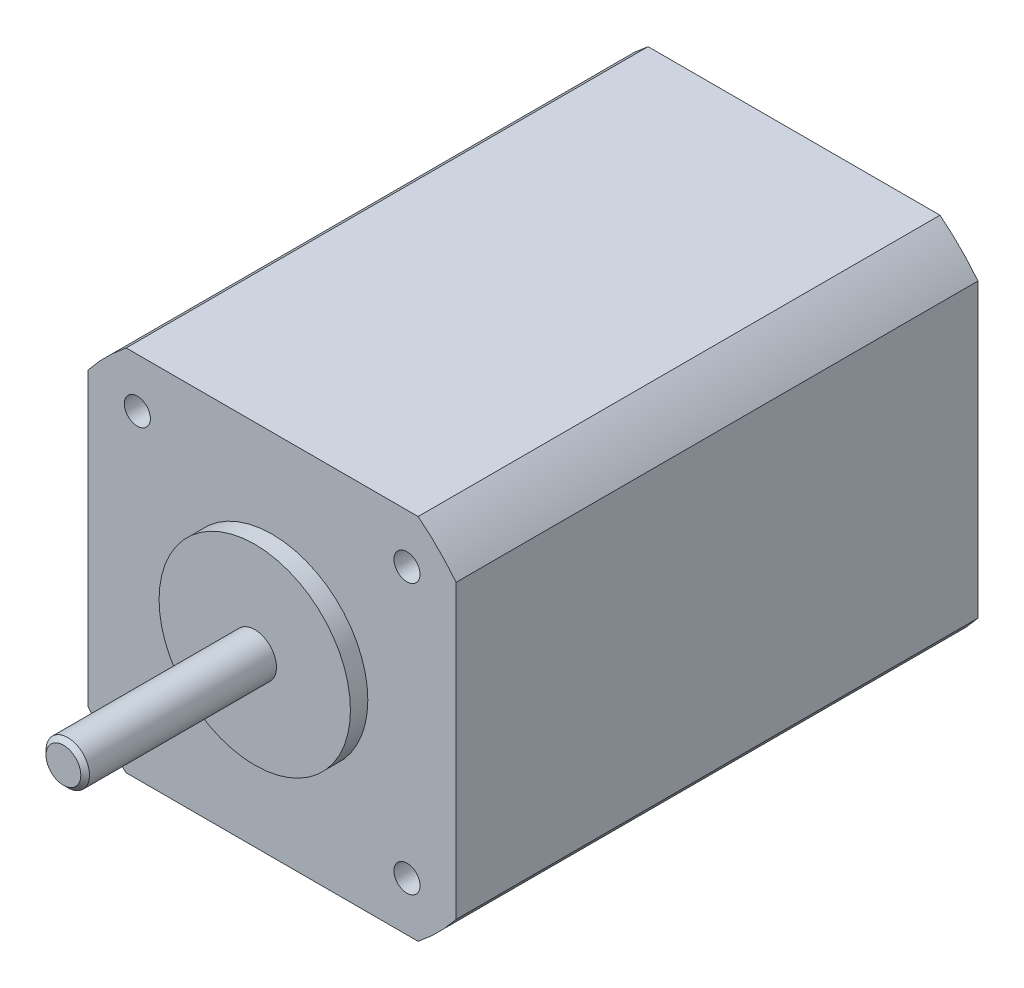
ISO-10303-21;
HEADER;
FILE_DESCRIPTION(('STEP AP214'),'2;1');
FILE_NAME('part.step','',(''),(''),'','','');
FILE_SCHEMA(('AUTOMOTIVE_DESIGN { 1 0 10303 214 1 1 1 1 }'));
ENDSEC;
DATA;
#1=APPLICATION_CONTEXT('core data for automotive mechanical design processes');
#2=APPLICATION_PROTOCOL_DEFINITION('international standard','automotive_design',2000,#1);
#3=PRODUCT_CONTEXT('',#1,'mechanical');
#4=PRODUCT('Part','Part','',(#3));
#5=PRODUCT_RELATED_PRODUCT_CATEGORY('part','',(#4));
#6=PRODUCT_DEFINITION_FORMATION('','',#4);
#7=PRODUCT_DEFINITION_CONTEXT('part definition',#1,'design');
#8=PRODUCT_DEFINITION('design','',#6,#7);
#9=PRODUCT_DEFINITION_SHAPE('','',#8);
#10=(LENGTH_UNIT() NAMED_UNIT(*) SI_UNIT(.MILLI.,.METRE.));
#11=(NAMED_UNIT(*) PLANE_ANGLE_UNIT() SI_UNIT($,.RADIAN.));
#12=(NAMED_UNIT(*) SI_UNIT($,.STERADIAN.) SOLID_ANGLE_UNIT());
#13=UNCERTAINTY_MEASURE_WITH_UNIT(LENGTH_MEASURE(1.E-05),#10,'distance_accuracy_value','');
#14=(GEOMETRIC_REPRESENTATION_CONTEXT(3) GLOBAL_UNCERTAINTY_ASSIGNED_CONTEXT((#13)) GLOBAL_UNIT_ASSIGNED_CONTEXT((#10,
#11,#12)) REPRESENTATION_CONTEXT('',''));
#15=CARTESIAN_POINT('',(0.,0.,0.));
#16=DIRECTION('',(0.,0.,1.));
#17=DIRECTION('',(1.,0.,0.));
#18=AXIS2_PLACEMENT_3D('',#15,#16,#17);
#19=CARTESIAN_POINT('',(21.15,-21.15,60.));
#20=DIRECTION('',(-1.,0.,0.));
#21=DIRECTION('',(0.,0.,1.));
#22=AXIS2_PLACEMENT_3D('',#19,#20,#21);
#23=PLANE('',#22);
#24=DIRECTION('',(0.,0.,1.));
#25=VECTOR('',#24,1.);
#26=CARTESIAN_POINT('',(21.15,-16.7832505790744,0.));
#27=LINE('',#26,#25);
#28=CARTESIAN_POINT('',(21.15,-16.7832505790744,0.));
#29=VERTEX_POINT('',#28);
#30=CARTESIAN_POINT('',(21.15,-16.7832505790744,60.));
#31=VERTEX_POINT('',#30);
#32=EDGE_CURVE('E170',#29,#31,#27,.T.);
#33=ORIENTED_EDGE('',*,*,#32,.F.);
#34=DIRECTION('',(0.,1.,0.));
#35=VECTOR('',#34,1.);
#36=CARTESIAN_POINT('',(21.15,-21.15,0.));
#37=LINE('',#36,#35);
#38=CARTESIAN_POINT('',(21.15,16.7832505790744,0.));
#39=VERTEX_POINT('',#38);
#40=EDGE_CURVE('E130',#29,#39,#37,.T.);
#41=ORIENTED_EDGE('',*,*,#40,.T.);
#42=DIRECTION('',(0.,0.,1.));
#43=VECTOR('',#42,1.);
#44=CARTESIAN_POINT('',(21.15,16.7832505790744,0.));
#45=LINE('',#44,#43);
#46=CARTESIAN_POINT('',(21.15,16.7832505790744,60.));
#47=VERTEX_POINT('',#46);
#48=EDGE_CURVE('E110',#47,#39,#45,.F.);
#49=ORIENTED_EDGE('',*,*,#48,.F.);
#50=DIRECTION('',(0.,1.,0.));
#51=VECTOR('',#50,1.);
#52=CARTESIAN_POINT('',(21.15,-21.15,60.));
#53=LINE('',#52,#51);
#54=EDGE_CURVE('E141',#31,#47,#53,.T.);
#55=ORIENTED_EDGE('',*,*,#54,.F.);
#56=EDGE_LOOP('',(#33,#41,#49,#55));
#57=FACE_BOUND('',#56,.T.);
#58=ADVANCED_FACE('F39',(#57),#23,.F.);
#59=CARTESIAN_POINT('',(-21.15,21.15,60.));
#60=DIRECTION('',(0.,-1.,0.));
#61=DIRECTION('',(0.,0.,-1.));
#62=AXIS2_PLACEMENT_3D('',#59,#60,#61);
#63=PLANE('',#62);
#64=DIRECTION('',(0.,0.,1.));
#65=VECTOR('',#64,1.);
#66=CARTESIAN_POINT('',(16.7832505790744,21.15,0.));
#67=LINE('',#66,#65);
#68=CARTESIAN_POINT('',(16.7832505790744,21.15,0.));
#69=VERTEX_POINT('',#68);
#70=CARTESIAN_POINT('',(16.7832505790744,21.15,60.));
#71=VERTEX_POINT('',#70);
#72=EDGE_CURVE('E107',#69,#71,#67,.T.);
#73=ORIENTED_EDGE('',*,*,#72,.F.);
#74=DIRECTION('',(-1.,0.,0.));
#75=VECTOR('',#74,1.);
#76=CARTESIAN_POINT('',(-21.15,21.15,0.));
#77=LINE('',#76,#75);
#78=CARTESIAN_POINT('',(-16.7832505790744,21.15,0.));
#79=VERTEX_POINT('',#78);
#80=EDGE_CURVE('E122',#69,#79,#77,.T.);
#81=ORIENTED_EDGE('',*,*,#80,.T.);
#82=DIRECTION('',(0.,0.,1.));
#83=VECTOR('',#82,1.);
#84=CARTESIAN_POINT('',(-16.7832505790744,21.15,0.));
#85=LINE('',#84,#83);
#86=CARTESIAN_POINT('',(-16.7832505790744,21.15,60.));
#87=VERTEX_POINT('',#86);
#88=EDGE_CURVE('E55',#87,#79,#85,.F.);
#89=ORIENTED_EDGE('',*,*,#88,.F.);
#90=DIRECTION('',(-1.,0.,0.));
#91=VECTOR('',#90,1.);
#92=CARTESIAN_POINT('',(-21.15,21.15,60.));
#93=LINE('',#92,#91);
#94=EDGE_CURVE('E124',#71,#87,#93,.T.);
#95=ORIENTED_EDGE('',*,*,#94,.F.);
#96=EDGE_LOOP('',(#73,#81,#89,#95));
#97=FACE_BOUND('',#96,.T.);
#98=ADVANCED_FACE('F121',(#97),#63,.F.);
#99=CARTESIAN_POINT('',(-21.15,-21.15,60.));
#100=DIRECTION('',(1.,0.,0.));
#101=DIRECTION('',(0.,0.,-1.));
#102=AXIS2_PLACEMENT_3D('',#99,#100,#101);
#103=PLANE('',#102);
#104=DIRECTION('',(0.,0.,1.));
#105=VECTOR('',#104,1.);
#106=CARTESIAN_POINT('',(-21.15,16.7832505790744,0.));
#107=LINE('',#106,#105);
#108=CARTESIAN_POINT('',(-21.15,16.7832505790744,0.));
#109=VERTEX_POINT('',#108);
#110=CARTESIAN_POINT('',(-21.15,16.7832505790744,60.));
#111=VERTEX_POINT('',#110);
#112=EDGE_CURVE('E166',#109,#111,#107,.T.);
#113=ORIENTED_EDGE('',*,*,#112,.F.);
#114=DIRECTION('',(0.,-1.,0.));
#115=VECTOR('',#114,1.);
#116=CARTESIAN_POINT('',(-21.15,-21.15,0.));
#117=LINE('',#116,#115);
#118=CARTESIAN_POINT('',(-21.15,-16.7832505790744,0.));
#119=VERTEX_POINT('',#118);
#120=EDGE_CURVE('E129',#109,#119,#117,.T.);
#121=ORIENTED_EDGE('',*,*,#120,.T.);
#122=DIRECTION('',(0.,0.,1.));
#123=VECTOR('',#122,1.);
#124=CARTESIAN_POINT('',(-21.15,-16.7832505790744,0.));
#125=LINE('',#124,#123);
#126=CARTESIAN_POINT('',(-21.15,-16.7832505790744,60.));
#127=VERTEX_POINT('',#126);
#128=EDGE_CURVE('E63',#127,#119,#125,.F.);
#129=ORIENTED_EDGE('',*,*,#128,.F.);
#130=DIRECTION('',(0.,-1.,0.));
#131=VECTOR('',#130,1.);
#132=CARTESIAN_POINT('',(-21.15,-21.15,60.));
#133=LINE('',#132,#131);
#134=EDGE_CURVE('E198',#111,#127,#133,.T.);
#135=ORIENTED_EDGE('',*,*,#134,.F.);
#136=EDGE_LOOP('',(#113,#121,#129,#135));
#137=FACE_BOUND('',#136,.T.);
#138=ADVANCED_FACE('F222',(#137),#103,.F.);
#139=CARTESIAN_POINT('',(-21.15,-21.15,60.));
#140=DIRECTION('',(0.,1.,0.));
#141=DIRECTION('',(0.,0.,1.));
#142=AXIS2_PLACEMENT_3D('',#139,#140,#141);
#143=PLANE('',#142);
#144=DIRECTION('',(0.,0.,1.));
#145=VECTOR('',#144,1.);
#146=CARTESIAN_POINT('',(-16.7832505790744,-21.15,0.));
#147=LINE('',#146,#145);
#148=CARTESIAN_POINT('',(-16.7832505790744,-21.15,0.));
#149=VERTEX_POINT('',#148);
#150=CARTESIAN_POINT('',(-16.7832505790744,-21.15,60.));
#151=VERTEX_POINT('',#150);
#152=EDGE_CURVE('E163',#149,#151,#147,.T.);
#153=ORIENTED_EDGE('',*,*,#152,.F.);
#154=DIRECTION('',(1.,0.,0.));
#155=VECTOR('',#154,1.);
#156=CARTESIAN_POINT('',(-21.15,-21.15,0.));
#157=LINE('',#156,#155);
#158=CARTESIAN_POINT('',(16.7832505790744,-21.15,0.));
#159=VERTEX_POINT('',#158);
#160=EDGE_CURVE('E133',#149,#159,#157,.T.);
#161=ORIENTED_EDGE('',*,*,#160,.T.);
#162=DIRECTION('',(0.,0.,1.));
#163=VECTOR('',#162,1.);
#164=CARTESIAN_POINT('',(16.7832505790744,-21.15,0.));
#165=LINE('',#164,#163);
#166=CARTESIAN_POINT('',(16.7832505790744,-21.15,60.));
#167=VERTEX_POINT('',#166);
#168=EDGE_CURVE('E115',#167,#159,#165,.F.);
#169=ORIENTED_EDGE('',*,*,#168,.F.);
#170=DIRECTION('',(1.,0.,0.));
#171=VECTOR('',#170,1.);
#172=CARTESIAN_POINT('',(-21.15,-21.15,60.));
#173=LINE('',#172,#171);
#174=EDGE_CURVE('E145',#151,#167,#173,.T.);
#175=ORIENTED_EDGE('',*,*,#174,.F.);
#176=EDGE_LOOP('',(#153,#161,#169,#175));
#177=FACE_BOUND('',#176,.T.);
#178=ADVANCED_FACE('F212',(#177),#143,.F.);
#179=CARTESIAN_POINT('',(0.,0.,60.));
#180=DIRECTION('',(0.,0.,-1.));
#181=DIRECTION('',(-1.,0.,0.));
#182=AXIS2_PLACEMENT_3D('',#179,#180,#181);
#183=PLANE('',#182);
#184=CARTESIAN_POINT('',(0.,0.,60.));
#185=DIRECTION('',(0.,0.,1.));
#186=DIRECTION('',(1.,0.,0.));
#187=AXIS2_PLACEMENT_3D('',#184,#185,#186);
#188=CIRCLE('',#187,11.);
#189=CARTESIAN_POINT('',(11.,0.,60.));
#190=VERTEX_POINT('',#189);
#191=EDGE_CURVE('E150',#190,#190,#188,.T.);
#192=ORIENTED_EDGE('',*,*,#191,.F.);
#193=EDGE_LOOP('',(#192));
#194=FACE_BOUND('',#193,.T.);
#195=CARTESIAN_POINT('',(15.5,15.5,60.));
#196=DIRECTION('',(0.,0.,1.));
#197=DIRECTION('',(1.,0.,0.));
#198=AXIS2_PLACEMENT_3D('',#195,#196,#197);
#199=CIRCLE('',#198,1.5);
#200=CARTESIAN_POINT('',(17.,15.5,60.));
#201=VERTEX_POINT('',#200);
#202=EDGE_CURVE('E186',#201,#201,#199,.T.);
#203=ORIENTED_EDGE('',*,*,#202,.F.);
#204=EDGE_LOOP('',(#203));
#205=FACE_BOUND('',#204,.T.);
#206=CARTESIAN_POINT('',(15.5,-15.5,60.));
#207=DIRECTION('',(0.,0.,1.));
#208=DIRECTION('',(1.,0.,0.));
#209=AXIS2_PLACEMENT_3D('',#206,#207,#208);
#210=CIRCLE('',#209,1.5);
#211=CARTESIAN_POINT('',(17.,-15.5,60.));
#212=VERTEX_POINT('',#211);
#213=EDGE_CURVE('E180',#212,#212,#210,.T.);
#214=ORIENTED_EDGE('',*,*,#213,.F.);
#215=EDGE_LOOP('',(#214));
#216=FACE_BOUND('',#215,.T.);
#217=CARTESIAN_POINT('',(-15.5,-15.5,60.));
#218=DIRECTION('',(0.,0.,1.));
#219=DIRECTION('',(1.,0.,0.));
#220=AXIS2_PLACEMENT_3D('',#217,#218,#219);
#221=CIRCLE('',#220,1.5);
#222=CARTESIAN_POINT('',(-14.,-15.5,60.));
#223=VERTEX_POINT('',#222);
#224=EDGE_CURVE('E173',#223,#223,#221,.T.);
#225=ORIENTED_EDGE('',*,*,#224,.F.);
#226=EDGE_LOOP('',(#225));
#227=FACE_BOUND('',#226,.T.);
#228=CARTESIAN_POINT('',(-15.5,15.5,60.));
#229=DIRECTION('',(0.,0.,1.));
#230=DIRECTION('',(1.,0.,0.));
#231=AXIS2_PLACEMENT_3D('',#228,#229,#230);
#232=CIRCLE('',#231,1.5);
#233=CARTESIAN_POINT('',(-14.,15.5,60.));
#234=VERTEX_POINT('',#233);
#235=EDGE_CURVE('E176',#234,#234,#232,.T.);
#236=ORIENTED_EDGE('',*,*,#235,.F.);
#237=EDGE_LOOP('',(#236));
#238=FACE_BOUND('',#237,.T.);
#239=CARTESIAN_POINT('',(0.,0.,60.));
#240=DIRECTION('',(0.,0.,1.));
#241=DIRECTION('',(1.,0.,0.));
#242=AXIS2_PLACEMENT_3D('',#239,#240,#241);
#243=CIRCLE('',#242,27.);
#244=EDGE_CURVE('E160',#87,#111,#243,.T.);
#245=ORIENTED_EDGE('',*,*,#244,.T.);
#246=ORIENTED_EDGE('',*,*,#134,.T.);
#247=EDGE_CURVE('E208',#127,#151,#243,.T.);
#248=ORIENTED_EDGE('',*,*,#247,.T.);
#249=ORIENTED_EDGE('',*,*,#174,.T.);
#250=EDGE_CURVE('E161',#167,#31,#243,.T.);
#251=ORIENTED_EDGE('',*,*,#250,.T.);
#252=ORIENTED_EDGE('',*,*,#54,.T.);
#253=EDGE_CURVE('E116',#47,#71,#243,.T.);
#254=ORIENTED_EDGE('',*,*,#253,.T.);
#255=ORIENTED_EDGE('',*,*,#94,.T.);
#256=EDGE_LOOP('',(#245,#246,#248,#249,#251,#252,#254,#255));
#257=FACE_BOUND('',#256,.T.);
#258=ADVANCED_FACE('F206',(#194,#205,#216,#227,#238,#257),#183,.F.);
#259=CARTESIAN_POINT('',(0.,0.,0.));
#260=DIRECTION('',(0.,0.,-1.));
#261=DIRECTION('',(-1.,0.,0.));
#262=AXIS2_PLACEMENT_3D('',#259,#260,#261);
#263=PLANE('',#262);
#264=ORIENTED_EDGE('',*,*,#120,.F.);
#265=CARTESIAN_POINT('',(0.,0.,0.));
#266=DIRECTION('',(0.,0.,-1.));
#267=DIRECTION('',(-1.,0.,0.));
#268=AXIS2_PLACEMENT_3D('',#265,#266,#267);
#269=CIRCLE('',#268,27.);
#270=EDGE_CURVE('E128',#109,#79,#269,.T.);
#271=ORIENTED_EDGE('',*,*,#270,.T.);
#272=ORIENTED_EDGE('',*,*,#80,.F.);
#273=CARTESIAN_POINT('',(0.,0.,0.));
#274=DIRECTION('',(0.,0.,1.));
#275=DIRECTION('',(1.,0.,0.));
#276=AXIS2_PLACEMENT_3D('',#273,#274,#275);
#277=CIRCLE('',#276,27.);
#278=EDGE_CURVE('E104',#39,#69,#277,.T.);
#279=ORIENTED_EDGE('',*,*,#278,.F.);
#280=ORIENTED_EDGE('',*,*,#40,.F.);
#281=EDGE_CURVE('E144',#29,#159,#269,.T.);
#282=ORIENTED_EDGE('',*,*,#281,.T.);
#283=ORIENTED_EDGE('',*,*,#160,.F.);
#284=EDGE_CURVE('E142',#149,#119,#269,.T.);
#285=ORIENTED_EDGE('',*,*,#284,.T.);
#286=EDGE_LOOP('',(#264,#271,#272,#279,#280,#282,#283,#285));
#287=FACE_BOUND('',#286,.T.);
#288=ADVANCED_FACE('F127',(#287),#263,.T.);
#289=CARTESIAN_POINT('',(-15.5,15.5,55.5));
#290=DIRECTION('',(0.,0.,1.));
#291=DIRECTION('',(1.,0.,0.));
#292=AXIS2_PLACEMENT_3D('',#289,#290,#291);
#293=CYLINDRICAL_SURFACE('',#292,1.5);
#294=CARTESIAN_POINT('',(-15.5,15.5,55.5));
#295=DIRECTION('',(0.,0.,1.));
#296=DIRECTION('',(1.,0.,0.));
#297=AXIS2_PLACEMENT_3D('',#294,#295,#296);
#298=CIRCLE('',#297,1.5);
#299=CARTESIAN_POINT('',(-14.,15.5,55.5));
#300=VERTEX_POINT('',#299);
#301=EDGE_CURVE('E135',#300,#300,#298,.T.);
#302=ORIENTED_EDGE('',*,*,#301,.F.);
#303=EDGE_LOOP('',(#302));
#304=FACE_BOUND('',#303,.T.);
#305=ORIENTED_EDGE('',*,*,#235,.T.);
#306=EDGE_LOOP('',(#305));
#307=FACE_BOUND('',#306,.T.);
#308=ADVANCED_FACE('F253',(#304,#307),#293,.F.);
#309=CARTESIAN_POINT('',(-15.5,15.5,55.5));
#310=DIRECTION('',(0.,0.,1.));
#311=DIRECTION('',(1.,0.,0.));
#312=AXIS2_PLACEMENT_3D('',#309,#310,#311);
#313=PLANE('',#312);
#314=ORIENTED_EDGE('',*,*,#301,.T.);
#315=EDGE_LOOP('',(#314));
#316=FACE_BOUND('',#315,.T.);
#317=ADVANCED_FACE('F259',(#316),#313,.T.);
#318=CARTESIAN_POINT('',(-15.5,-15.5,55.5));
#319=DIRECTION('',(0.,0.,1.));
#320=DIRECTION('',(1.,0.,0.));
#321=AXIS2_PLACEMENT_3D('',#318,#319,#320);
#322=CYLINDRICAL_SURFACE('',#321,1.5);
#323=CARTESIAN_POINT('',(-15.5,-15.5,55.5));
#324=DIRECTION('',(0.,0.,1.));
#325=DIRECTION('',(1.,0.,0.));
#326=AXIS2_PLACEMENT_3D('',#323,#324,#325);
#327=CIRCLE('',#326,1.5);
#328=CARTESIAN_POINT('',(-14.,-15.5,55.5));
#329=VERTEX_POINT('',#328);
#330=EDGE_CURVE('E177',#329,#329,#327,.T.);
#331=ORIENTED_EDGE('',*,*,#330,.F.);
#332=EDGE_LOOP('',(#331));
#333=FACE_BOUND('',#332,.T.);
#334=ORIENTED_EDGE('',*,*,#224,.T.);
#335=EDGE_LOOP('',(#334));
#336=FACE_BOUND('',#335,.T.);
#337=ADVANCED_FACE('F263',(#333,#336),#322,.F.);
#338=CARTESIAN_POINT('',(-15.5,-15.5,55.5));
#339=DIRECTION('',(0.,0.,1.));
#340=DIRECTION('',(1.,0.,0.));
#341=AXIS2_PLACEMENT_3D('',#338,#339,#340);
#342=PLANE('',#341);
#343=ORIENTED_EDGE('',*,*,#330,.T.);
#344=EDGE_LOOP('',(#343));
#345=FACE_BOUND('',#344,.T.);
#346=ADVANCED_FACE('F280',(#345),#342,.T.);
#347=CARTESIAN_POINT('',(15.5,-15.5,55.5));
#348=DIRECTION('',(0.,0.,1.));
#349=DIRECTION('',(1.,0.,0.));
#350=AXIS2_PLACEMENT_3D('',#347,#348,#349);
#351=CYLINDRICAL_SURFACE('',#350,1.5);
#352=CARTESIAN_POINT('',(15.5,-15.5,55.5));
#353=DIRECTION('',(0.,0.,1.));
#354=DIRECTION('',(1.,0.,0.));
#355=AXIS2_PLACEMENT_3D('',#352,#353,#354);
#356=CIRCLE('',#355,1.5);
#357=CARTESIAN_POINT('',(17.,-15.5,55.5));
#358=VERTEX_POINT('',#357);
#359=EDGE_CURVE('E183',#358,#358,#356,.T.);
#360=ORIENTED_EDGE('',*,*,#359,.F.);
#361=EDGE_LOOP('',(#360));
#362=FACE_BOUND('',#361,.T.);
#363=ORIENTED_EDGE('',*,*,#213,.T.);
#364=EDGE_LOOP('',(#363));
#365=FACE_BOUND('',#364,.T.);
#366=ADVANCED_FACE('F276',(#362,#365),#351,.F.);
#367=CARTESIAN_POINT('',(15.5,-15.5,55.5));
#368=DIRECTION('',(0.,0.,1.));
#369=DIRECTION('',(1.,0.,0.));
#370=AXIS2_PLACEMENT_3D('',#367,#368,#369);
#371=PLANE('',#370);
#372=ORIENTED_EDGE('',*,*,#359,.T.);
#373=EDGE_LOOP('',(#372));
#374=FACE_BOUND('',#373,.T.);
#375=ADVANCED_FACE('F272',(#374),#371,.T.);
#376=CARTESIAN_POINT('',(15.5,15.5,55.5));
#377=DIRECTION('',(0.,0.,1.));
#378=DIRECTION('',(1.,0.,0.));
#379=AXIS2_PLACEMENT_3D('',#376,#377,#378);
#380=CYLINDRICAL_SURFACE('',#379,1.5);
#381=CARTESIAN_POINT('',(15.5,15.5,55.5));
#382=DIRECTION('',(0.,0.,1.));
#383=DIRECTION('',(1.,0.,0.));
#384=AXIS2_PLACEMENT_3D('',#381,#382,#383);
#385=CIRCLE('',#384,1.5);
#386=CARTESIAN_POINT('',(17.,15.5,55.5));
#387=VERTEX_POINT('',#386);
#388=EDGE_CURVE('E172',#387,#387,#385,.T.);
#389=ORIENTED_EDGE('',*,*,#388,.F.);
#390=EDGE_LOOP('',(#389));
#391=FACE_BOUND('',#390,.T.);
#392=ORIENTED_EDGE('',*,*,#202,.T.);
#393=EDGE_LOOP('',(#392));
#394=FACE_BOUND('',#393,.T.);
#395=ADVANCED_FACE('F268',(#391,#394),#380,.F.);
#396=CARTESIAN_POINT('',(15.5,15.5,55.5));
#397=DIRECTION('',(0.,0.,1.));
#398=DIRECTION('',(1.,0.,0.));
#399=AXIS2_PLACEMENT_3D('',#396,#397,#398);
#400=PLANE('',#399);
#401=ORIENTED_EDGE('',*,*,#388,.T.);
#402=EDGE_LOOP('',(#401));
#403=FACE_BOUND('',#402,.T.);
#404=ADVANCED_FACE('F265',(#403),#400,.T.);
#405=CARTESIAN_POINT('',(0.,0.,0.));
#406=DIRECTION('',(0.,0.,1.));
#407=DIRECTION('',(1.,0.,0.));
#408=AXIS2_PLACEMENT_3D('',#405,#406,#407);
#409=CYLINDRICAL_SURFACE('',#408,27.);
#410=ORIENTED_EDGE('',*,*,#128,.T.);
#411=ORIENTED_EDGE('',*,*,#284,.F.);
#412=ORIENTED_EDGE('',*,*,#152,.T.);
#413=ORIENTED_EDGE('',*,*,#247,.F.);
#414=EDGE_LOOP('',(#410,#411,#412,#413));
#415=FACE_BOUND('',#414,.T.);
#416=ADVANCED_FACE('F223',(#415),#409,.T.);
#417=ORIENTED_EDGE('',*,*,#32,.T.);
#418=ORIENTED_EDGE('',*,*,#250,.F.);
#419=ORIENTED_EDGE('',*,*,#168,.T.);
#420=ORIENTED_EDGE('',*,*,#281,.F.);
#421=EDGE_LOOP('',(#417,#418,#419,#420));
#422=FACE_BOUND('',#421,.T.);
#423=ADVANCED_FACE('F216',(#422),#409,.T.);
#424=ORIENTED_EDGE('',*,*,#48,.T.);
#425=ORIENTED_EDGE('',*,*,#278,.T.);
#426=ORIENTED_EDGE('',*,*,#72,.T.);
#427=ORIENTED_EDGE('',*,*,#253,.F.);
#428=EDGE_LOOP('',(#424,#425,#426,#427));
#429=FACE_BOUND('',#428,.T.);
#430=ADVANCED_FACE('F106',(#429),#409,.T.);
#431=ORIENTED_EDGE('',*,*,#88,.T.);
#432=ORIENTED_EDGE('',*,*,#270,.F.);
#433=ORIENTED_EDGE('',*,*,#112,.T.);
#434=ORIENTED_EDGE('',*,*,#244,.F.);
#435=EDGE_LOOP('',(#431,#432,#433,#434));
#436=FACE_BOUND('',#435,.T.);
#437=ADVANCED_FACE('F231',(#436),#409,.T.);
#438=CARTESIAN_POINT('',(0.,0.,62.));
#439=DIRECTION('',(0.,0.,-1.));
#440=DIRECTION('',(-1.,0.,0.));
#441=AXIS2_PLACEMENT_3D('',#438,#439,#440);
#442=CYLINDRICAL_SURFACE('',#441,11.);
#443=CARTESIAN_POINT('',(0.,0.,62.));
#444=DIRECTION('',(0.,0.,1.));
#445=DIRECTION('',(1.,0.,0.));
#446=AXIS2_PLACEMENT_3D('',#443,#444,#445);
#447=CIRCLE('',#446,11.);
#448=CARTESIAN_POINT('',(11.,0.,62.));
#449=VERTEX_POINT('',#448);
#450=EDGE_CURVE('E148',#449,#449,#447,.T.);
#451=ORIENTED_EDGE('',*,*,#450,.F.);
#452=EDGE_LOOP('',(#451));
#453=FACE_BOUND('',#452,.T.);
#454=ORIENTED_EDGE('',*,*,#191,.T.);
#455=EDGE_LOOP('',(#454));
#456=FACE_BOUND('',#455,.T.);
#457=ADVANCED_FACE('F229',(#453,#456),#442,.T.);
#458=CARTESIAN_POINT('',(0.,0.,62.));
#459=DIRECTION('',(0.,0.,1.));
#460=DIRECTION('',(1.,0.,0.));
#461=AXIS2_PLACEMENT_3D('',#458,#459,#460);
#462=PLANE('',#461);
#463=CARTESIAN_POINT('',(0.,0.,62.));
#464=DIRECTION('',(0.,0.,1.));
#465=DIRECTION('',(1.,0.,0.));
#466=AXIS2_PLACEMENT_3D('',#463,#464,#465);
#467=CIRCLE('',#466,2.5);
#468=CARTESIAN_POINT('',(2.5,0.,62.));
#469=VERTEX_POINT('',#468);
#470=EDGE_CURVE('E146',#469,#469,#467,.F.);
#471=ORIENTED_EDGE('',*,*,#470,.T.);
#472=EDGE_LOOP('',(#471));
#473=FACE_BOUND('',#472,.T.);
#474=ORIENTED_EDGE('',*,*,#450,.T.);
#475=EDGE_LOOP('',(#474));
#476=FACE_BOUND('',#475,.T.);
#477=ADVANCED_FACE('F227',(#473,#476),#462,.T.);
#478=CARTESIAN_POINT('',(0.,0.,84.));
#479=DIRECTION('',(0.,0.,-1.));
#480=DIRECTION('',(-1.,0.,0.));
#481=AXIS2_PLACEMENT_3D('',#478,#479,#480);
#482=CYLINDRICAL_SURFACE('',#481,2.5);
#483=CARTESIAN_POINT('',(0.,0.,83.5));
#484=DIRECTION('',(0.,0.,1.));
#485=DIRECTION('',(1.,0.,0.));
#486=AXIS2_PLACEMENT_3D('',#483,#484,#485);
#487=CIRCLE('',#486,2.5);
#488=CARTESIAN_POINT('',(2.5,0.,83.5));
#489=VERTEX_POINT('',#488);
#490=EDGE_CURVE('E11',#489,#489,#487,.F.);
#491=ORIENTED_EDGE('',*,*,#490,.T.);
#492=EDGE_LOOP('',(#491));
#493=FACE_BOUND('',#492,.T.);
#494=ORIENTED_EDGE('',*,*,#470,.F.);
#495=EDGE_LOOP('',(#494));
#496=FACE_BOUND('',#495,.T.);
#497=ADVANCED_FACE('F237',(#493,#496),#482,.T.);
#498=CARTESIAN_POINT('',(0.,0.,84.));
#499=DIRECTION('',(0.,0.,1.));
#500=DIRECTION('',(1.,0.,0.));
#501=AXIS2_PLACEMENT_3D('',#498,#499,#500);
#502=PLANE('',#501);
#503=CARTESIAN_POINT('',(0.,0.,84.));
#504=DIRECTION('',(0.,0.,1.));
#505=DIRECTION('',(1.,0.,0.));
#506=AXIS2_PLACEMENT_3D('',#503,#504,#505);
#507=CIRCLE('',#506,2.);
#508=CARTESIAN_POINT('',(2.,0.,84.));
#509=VERTEX_POINT('',#508);
#510=EDGE_CURVE('E48',#509,#509,#507,.T.);
#511=ORIENTED_EDGE('',*,*,#510,.T.);
#512=EDGE_LOOP('',(#511));
#513=FACE_BOUND('',#512,.T.);
#514=ADVANCED_FACE('F401',(#513),#502,.T.);
#515=CARTESIAN_POINT('',(0.,0.,84.));
#516=DIRECTION('',(0.,0.,-1.));
#517=DIRECTION('',(-1.,0.,0.));
#518=AXIS2_PLACEMENT_3D('',#515,#516,#517);
#519=CONICAL_SURFACE('',#518,2.,0.785398163397446);
#520=ORIENTED_EDGE('',*,*,#490,.F.);
#521=EDGE_LOOP('',(#520));
#522=FACE_BOUND('',#521,.T.);
#523=ORIENTED_EDGE('',*,*,#510,.F.);
#524=EDGE_LOOP('',(#523));
#525=FACE_BOUND('',#524,.T.);
#526=ADVANCED_FACE('F42',(#522,#525),#519,.T.);
#527=CLOSED_SHELL('',(#58,#98,#138,#178,#258,#288,#308,#317,#337,#346,#366,#375,#395,#404,#416,
#423,#430,#437,#457,#477,#497,#514,#526));
#528=MANIFOLD_SOLID_BREP('B2',#527);
#529=ADVANCED_BREP_SHAPE_REPRESENTATION('',(#18,#528),#14);
#530=SHAPE_DEFINITION_REPRESENTATION(#9,#529);
ENDSEC;
END-ISO-10303-21;
